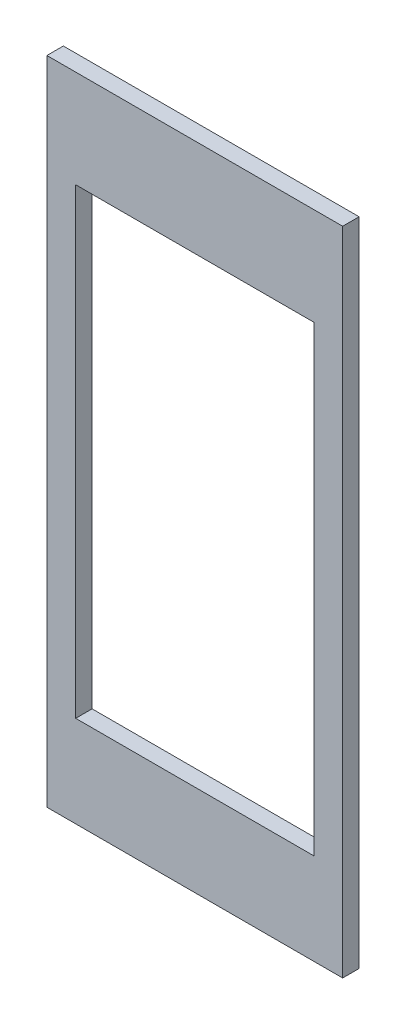
ISO-10303-21;
HEADER;
FILE_DESCRIPTION(('STEP AP214'),'2;1');
FILE_NAME('part.step','',(''),(''),'','','');
FILE_SCHEMA(('AUTOMOTIVE_DESIGN { 1 0 10303 214 1 1 1 1 }'));
ENDSEC;
DATA;
#1=APPLICATION_CONTEXT('core data for automotive mechanical design processes');
#2=APPLICATION_PROTOCOL_DEFINITION('international standard','automotive_design',2000,#1);
#3=PRODUCT_CONTEXT('',#1,'mechanical');
#4=PRODUCT('Part','Part','',(#3));
#5=PRODUCT_RELATED_PRODUCT_CATEGORY('part','',(#4));
#6=PRODUCT_DEFINITION_FORMATION('','',#4);
#7=PRODUCT_DEFINITION_CONTEXT('part definition',#1,'design');
#8=PRODUCT_DEFINITION('design','',#6,#7);
#9=PRODUCT_DEFINITION_SHAPE('','',#8);
#10=(LENGTH_UNIT() NAMED_UNIT(*) SI_UNIT(.MILLI.,.METRE.));
#11=(NAMED_UNIT(*) PLANE_ANGLE_UNIT() SI_UNIT($,.RADIAN.));
#12=(NAMED_UNIT(*) SI_UNIT($,.STERADIAN.) SOLID_ANGLE_UNIT());
#13=UNCERTAINTY_MEASURE_WITH_UNIT(LENGTH_MEASURE(1.E-05),#10,'distance_accuracy_value','');
#14=(GEOMETRIC_REPRESENTATION_CONTEXT(3) GLOBAL_UNCERTAINTY_ASSIGNED_CONTEXT((#13)) GLOBAL_UNIT_ASSIGNED_CONTEXT((#10,
#11,#12)) REPRESENTATION_CONTEXT('',''));
#15=CARTESIAN_POINT('',(0.,0.,0.));
#16=DIRECTION('',(0.,0.,1.));
#17=DIRECTION('',(1.,0.,0.));
#18=AXIS2_PLACEMENT_3D('',#15,#16,#17);
#19=CARTESIAN_POINT('',(0.,0.,1.5875));
#20=DIRECTION('',(0.,0.,1.));
#21=DIRECTION('',(1.,0.,0.));
#22=AXIS2_PLACEMENT_3D('',#19,#20,#21);
#23=PLANE('',#22);
#24=DIRECTION('',(0.,-1.,0.));
#25=VECTOR('',#24,1.);
#26=CARTESIAN_POINT('',(-28.575,62.9046875,1.5875));
#27=LINE('',#26,#25);
#28=CARTESIAN_POINT('',(-28.575,62.9046875,1.5875));
#29=VERTEX_POINT('',#28);
#30=CARTESIAN_POINT('',(-28.575,-62.9046875,1.5875));
#31=VERTEX_POINT('',#30);
#32=EDGE_CURVE('E138',#29,#31,#27,.T.);
#33=ORIENTED_EDGE('',*,*,#32,.T.);
#34=DIRECTION('',(1.,0.,0.));
#35=VECTOR('',#34,1.);
#36=CARTESIAN_POINT('',(-28.575,-62.9046875,1.5875));
#37=LINE('',#36,#35);
#38=CARTESIAN_POINT('',(28.575,-62.9046875,1.5875));
#39=VERTEX_POINT('',#38);
#40=EDGE_CURVE('E141',#31,#39,#37,.T.);
#41=ORIENTED_EDGE('',*,*,#40,.T.);
#42=DIRECTION('',(0.,1.,0.));
#43=VECTOR('',#42,1.);
#44=CARTESIAN_POINT('',(28.575,62.9046875,1.5875));
#45=LINE('',#44,#43);
#46=CARTESIAN_POINT('',(28.575,62.9046875,1.5875));
#47=VERTEX_POINT('',#46);
#48=EDGE_CURVE('E144',#39,#47,#45,.T.);
#49=ORIENTED_EDGE('',*,*,#48,.T.);
#50=DIRECTION('',(-1.,0.,0.));
#51=VECTOR('',#50,1.);
#52=CARTESIAN_POINT('',(-28.575,62.9046875,1.5875));
#53=LINE('',#52,#51);
#54=EDGE_CURVE('E146',#47,#29,#53,.T.);
#55=ORIENTED_EDGE('',*,*,#54,.T.);
#56=EDGE_LOOP('',(#33,#41,#49,#55));
#57=FACE_BOUND('',#56,.T.);
#58=DIRECTION('',(1.,0.,0.));
#59=VECTOR('',#58,1.);
#60=CARTESIAN_POINT('',(-23.01875,-45.24375,1.5875));
#61=LINE('',#60,#59);
#62=CARTESIAN_POINT('',(-23.01875,-45.24375,1.5875));
#63=VERTEX_POINT('',#62);
#64=CARTESIAN_POINT('',(23.01875,-45.24375,1.5875));
#65=VERTEX_POINT('',#64);
#66=EDGE_CURVE('E110',#63,#65,#61,.T.);
#67=ORIENTED_EDGE('',*,*,#66,.F.);
#68=DIRECTION('',(0.,-1.,0.));
#69=VECTOR('',#68,1.);
#70=CARTESIAN_POINT('',(-23.01875,44.053125,1.5875));
#71=LINE('',#70,#69);
#72=CARTESIAN_POINT('',(-23.01875,44.053125,1.5875));
#73=VERTEX_POINT('',#72);
#74=EDGE_CURVE('E102',#73,#63,#71,.T.);
#75=ORIENTED_EDGE('',*,*,#74,.F.);
#76=DIRECTION('',(-1.,0.,0.));
#77=VECTOR('',#76,1.);
#78=CARTESIAN_POINT('',(-23.01875,44.053125,1.5875));
#79=LINE('',#78,#77);
#80=CARTESIAN_POINT('',(23.01875,44.053125,1.5875));
#81=VERTEX_POINT('',#80);
#82=EDGE_CURVE('E124',#81,#73,#79,.T.);
#83=ORIENTED_EDGE('',*,*,#82,.F.);
#84=DIRECTION('',(0.,1.,0.));
#85=VECTOR('',#84,1.);
#86=CARTESIAN_POINT('',(23.01875,44.053125,1.5875));
#87=LINE('',#86,#85);
#88=EDGE_CURVE('E122',#65,#81,#87,.T.);
#89=ORIENTED_EDGE('',*,*,#88,.F.);
#90=EDGE_LOOP('',(#67,#75,#83,#89));
#91=FACE_BOUND('',#90,.T.);
#92=ADVANCED_FACE('F37',(#57,#91),#23,.T.);
#93=CARTESIAN_POINT('',(0.,0.,-1.5875));
#94=DIRECTION('',(0.,0.,1.));
#95=DIRECTION('',(1.,0.,0.));
#96=AXIS2_PLACEMENT_3D('',#93,#94,#95);
#97=PLANE('',#96);
#98=DIRECTION('',(0.,-1.,0.));
#99=VECTOR('',#98,1.);
#100=CARTESIAN_POINT('',(-28.575,62.9046875,-1.5875));
#101=LINE('',#100,#99);
#102=CARTESIAN_POINT('',(-28.575,62.9046875,-1.5875));
#103=VERTEX_POINT('',#102);
#104=CARTESIAN_POINT('',(-28.575,-62.9046875,-1.5875));
#105=VERTEX_POINT('',#104);
#106=EDGE_CURVE('E118',#103,#105,#101,.T.);
#107=ORIENTED_EDGE('',*,*,#106,.F.);
#108=DIRECTION('',(-1.,0.,0.));
#109=VECTOR('',#108,1.);
#110=CARTESIAN_POINT('',(-28.575,62.9046875,-1.5875));
#111=LINE('',#110,#109);
#112=CARTESIAN_POINT('',(28.575,62.9046875,-1.5875));
#113=VERTEX_POINT('',#112);
#114=EDGE_CURVE('E142',#113,#103,#111,.T.);
#115=ORIENTED_EDGE('',*,*,#114,.F.);
#116=DIRECTION('',(0.,1.,0.));
#117=VECTOR('',#116,1.);
#118=CARTESIAN_POINT('',(28.575,62.9046875,-1.5875));
#119=LINE('',#118,#117);
#120=CARTESIAN_POINT('',(28.575,-62.9046875,-1.5875));
#121=VERTEX_POINT('',#120);
#122=EDGE_CURVE('E153',#121,#113,#119,.T.);
#123=ORIENTED_EDGE('',*,*,#122,.F.);
#124=DIRECTION('',(1.,0.,0.));
#125=VECTOR('',#124,1.);
#126=CARTESIAN_POINT('',(-28.575,-62.9046875,-1.5875));
#127=LINE('',#126,#125);
#128=EDGE_CURVE('E151',#105,#121,#127,.T.);
#129=ORIENTED_EDGE('',*,*,#128,.F.);
#130=EDGE_LOOP('',(#107,#115,#123,#129));
#131=FACE_BOUND('',#130,.T.);
#132=DIRECTION('',(0.,-1.,0.));
#133=VECTOR('',#132,1.);
#134=CARTESIAN_POINT('',(-23.01875,44.053125,-1.5875));
#135=LINE('',#134,#133);
#136=CARTESIAN_POINT('',(-23.01875,44.053125,-1.5875));
#137=VERTEX_POINT('',#136);
#138=CARTESIAN_POINT('',(-23.01875,-45.24375,-1.5875));
#139=VERTEX_POINT('',#138);
#140=EDGE_CURVE('E60',#137,#139,#135,.T.);
#141=ORIENTED_EDGE('',*,*,#140,.T.);
#142=DIRECTION('',(1.,0.,0.));
#143=VECTOR('',#142,1.);
#144=CARTESIAN_POINT('',(-23.01875,-45.24375,-1.5875));
#145=LINE('',#144,#143);
#146=CARTESIAN_POINT('',(23.01875,-45.24375,-1.5875));
#147=VERTEX_POINT('',#146);
#148=EDGE_CURVE('E117',#139,#147,#145,.T.);
#149=ORIENTED_EDGE('',*,*,#148,.T.);
#150=DIRECTION('',(0.,1.,0.));
#151=VECTOR('',#150,1.);
#152=CARTESIAN_POINT('',(23.01875,44.053125,-1.5875));
#153=LINE('',#152,#151);
#154=CARTESIAN_POINT('',(23.01875,44.053125,-1.5875));
#155=VERTEX_POINT('',#154);
#156=EDGE_CURVE('E130',#147,#155,#153,.T.);
#157=ORIENTED_EDGE('',*,*,#156,.T.);
#158=DIRECTION('',(-1.,0.,0.));
#159=VECTOR('',#158,1.);
#160=CARTESIAN_POINT('',(-23.01875,44.053125,-1.5875));
#161=LINE('',#160,#159);
#162=EDGE_CURVE('E111',#155,#137,#161,.T.);
#163=ORIENTED_EDGE('',*,*,#162,.T.);
#164=EDGE_LOOP('',(#141,#149,#157,#163));
#165=FACE_BOUND('',#164,.T.);
#166=ADVANCED_FACE('F171',(#131,#165),#97,.F.);
#167=CARTESIAN_POINT('',(-28.575,62.9046875,1.5875));
#168=DIRECTION('',(1.,0.,0.));
#169=DIRECTION('',(0.,0.,-1.));
#170=AXIS2_PLACEMENT_3D('',#167,#168,#169);
#171=PLANE('',#170);
#172=ORIENTED_EDGE('',*,*,#106,.T.);
#173=DIRECTION('',(0.,0.,-1.));
#174=VECTOR('',#173,1.);
#175=CARTESIAN_POINT('',(-28.575,-62.9046875,1.5875));
#176=LINE('',#175,#174);
#177=EDGE_CURVE('E11',#31,#105,#176,.T.);
#178=ORIENTED_EDGE('',*,*,#177,.F.);
#179=ORIENTED_EDGE('',*,*,#32,.F.);
#180=DIRECTION('',(0.,0.,-1.));
#181=VECTOR('',#180,1.);
#182=CARTESIAN_POINT('',(-28.575,62.9046875,1.5875));
#183=LINE('',#182,#181);
#184=EDGE_CURVE('E148',#29,#103,#183,.T.);
#185=ORIENTED_EDGE('',*,*,#184,.T.);
#186=EDGE_LOOP('',(#172,#178,#179,#185));
#187=FACE_BOUND('',#186,.T.);
#188=ADVANCED_FACE('F39',(#187),#171,.F.);
#189=CARTESIAN_POINT('',(-28.575,-62.9046875,1.5875));
#190=DIRECTION('',(0.,1.,0.));
#191=DIRECTION('',(0.,0.,1.));
#192=AXIS2_PLACEMENT_3D('',#189,#190,#191);
#193=PLANE('',#192);
#194=ORIENTED_EDGE('',*,*,#128,.T.);
#195=DIRECTION('',(0.,0.,-1.));
#196=VECTOR('',#195,1.);
#197=CARTESIAN_POINT('',(28.575,-62.9046875,1.5875));
#198=LINE('',#197,#196);
#199=EDGE_CURVE('E45',#39,#121,#198,.T.);
#200=ORIENTED_EDGE('',*,*,#199,.F.);
#201=ORIENTED_EDGE('',*,*,#40,.F.);
#202=ORIENTED_EDGE('',*,*,#177,.T.);
#203=EDGE_LOOP('',(#194,#200,#201,#202));
#204=FACE_BOUND('',#203,.T.);
#205=ADVANCED_FACE('F181',(#204),#193,.F.);
#206=CARTESIAN_POINT('',(28.575,62.9046875,1.5875));
#207=DIRECTION('',(-1.,0.,0.));
#208=DIRECTION('',(0.,-1.,0.));
#209=AXIS2_PLACEMENT_3D('',#206,#207,#208);
#210=PLANE('',#209);
#211=ORIENTED_EDGE('',*,*,#122,.T.);
#212=DIRECTION('',(0.,0.,-1.));
#213=VECTOR('',#212,1.);
#214=CARTESIAN_POINT('',(28.575,62.9046875,1.5875));
#215=LINE('',#214,#213);
#216=EDGE_CURVE('E158',#47,#113,#215,.T.);
#217=ORIENTED_EDGE('',*,*,#216,.F.);
#218=ORIENTED_EDGE('',*,*,#48,.F.);
#219=ORIENTED_EDGE('',*,*,#199,.T.);
#220=EDGE_LOOP('',(#211,#217,#218,#219));
#221=FACE_BOUND('',#220,.T.);
#222=ADVANCED_FACE('F165',(#221),#210,.F.);
#223=CARTESIAN_POINT('',(-28.575,62.9046875,1.5875));
#224=DIRECTION('',(0.,-1.,0.));
#225=DIRECTION('',(1.,0.,0.));
#226=AXIS2_PLACEMENT_3D('',#223,#224,#225);
#227=PLANE('',#226);
#228=ORIENTED_EDGE('',*,*,#114,.T.);
#229=ORIENTED_EDGE('',*,*,#184,.F.);
#230=ORIENTED_EDGE('',*,*,#54,.F.);
#231=ORIENTED_EDGE('',*,*,#216,.T.);
#232=EDGE_LOOP('',(#228,#229,#230,#231));
#233=FACE_BOUND('',#232,.T.);
#234=ADVANCED_FACE('F175',(#233),#227,.F.);
#235=CARTESIAN_POINT('',(-23.01875,44.053125,1.5875));
#236=DIRECTION('',(1.,0.,0.));
#237=DIRECTION('',(0.,0.,-1.));
#238=AXIS2_PLACEMENT_3D('',#235,#236,#237);
#239=PLANE('',#238);
#240=ORIENTED_EDGE('',*,*,#140,.F.);
#241=DIRECTION('',(0.,0.,-1.));
#242=VECTOR('',#241,1.);
#243=CARTESIAN_POINT('',(-23.01875,44.053125,1.5875));
#244=LINE('',#243,#242);
#245=EDGE_CURVE('E106',#73,#137,#244,.T.);
#246=ORIENTED_EDGE('',*,*,#245,.F.);
#247=ORIENTED_EDGE('',*,*,#74,.T.);
#248=DIRECTION('',(0.,0.,-1.));
#249=VECTOR('',#248,1.);
#250=CARTESIAN_POINT('',(-23.01875,-45.24375,1.5875));
#251=LINE('',#250,#249);
#252=EDGE_CURVE('E105',#63,#139,#251,.T.);
#253=ORIENTED_EDGE('',*,*,#252,.T.);
#254=EDGE_LOOP('',(#240,#246,#247,#253));
#255=FACE_BOUND('',#254,.T.);
#256=ADVANCED_FACE('F104',(#255),#239,.T.);
#257=CARTESIAN_POINT('',(-23.01875,-45.24375,1.5875));
#258=DIRECTION('',(0.,1.,0.));
#259=DIRECTION('',(0.,0.,1.));
#260=AXIS2_PLACEMENT_3D('',#257,#258,#259);
#261=PLANE('',#260);
#262=ORIENTED_EDGE('',*,*,#148,.F.);
#263=ORIENTED_EDGE('',*,*,#252,.F.);
#264=ORIENTED_EDGE('',*,*,#66,.T.);
#265=DIRECTION('',(0.,0.,-1.));
#266=VECTOR('',#265,1.);
#267=CARTESIAN_POINT('',(23.01875,-45.24375,1.5875));
#268=LINE('',#267,#266);
#269=EDGE_CURVE('E119',#65,#147,#268,.T.);
#270=ORIENTED_EDGE('',*,*,#269,.T.);
#271=EDGE_LOOP('',(#262,#263,#264,#270));
#272=FACE_BOUND('',#271,.T.);
#273=ADVANCED_FACE('F114',(#272),#261,.T.);
#274=CARTESIAN_POINT('',(23.01875,44.053125,1.5875));
#275=DIRECTION('',(-1.,0.,0.));
#276=DIRECTION('',(0.,-1.,0.));
#277=AXIS2_PLACEMENT_3D('',#274,#275,#276);
#278=PLANE('',#277);
#279=ORIENTED_EDGE('',*,*,#156,.F.);
#280=ORIENTED_EDGE('',*,*,#269,.F.);
#281=ORIENTED_EDGE('',*,*,#88,.T.);
#282=DIRECTION('',(0.,0.,-1.));
#283=VECTOR('',#282,1.);
#284=CARTESIAN_POINT('',(23.01875,44.053125,1.5875));
#285=LINE('',#284,#283);
#286=EDGE_CURVE('E52',#81,#155,#285,.T.);
#287=ORIENTED_EDGE('',*,*,#286,.T.);
#288=EDGE_LOOP('',(#279,#280,#281,#287));
#289=FACE_BOUND('',#288,.T.);
#290=ADVANCED_FACE('F204',(#289),#278,.T.);
#291=CARTESIAN_POINT('',(-23.01875,44.053125,1.5875));
#292=DIRECTION('',(0.,-1.,0.));
#293=DIRECTION('',(0.,0.,-1.));
#294=AXIS2_PLACEMENT_3D('',#291,#292,#293);
#295=PLANE('',#294);
#296=ORIENTED_EDGE('',*,*,#162,.F.);
#297=ORIENTED_EDGE('',*,*,#286,.F.);
#298=ORIENTED_EDGE('',*,*,#82,.T.);
#299=ORIENTED_EDGE('',*,*,#245,.T.);
#300=EDGE_LOOP('',(#296,#297,#298,#299));
#301=FACE_BOUND('',#300,.T.);
#302=ADVANCED_FACE('F208',(#301),#295,.T.);
#303=CLOSED_SHELL('',(#92,#166,#188,#205,#222,#234,#256,#273,#290,#302));
#304=MANIFOLD_SOLID_BREP('B2',#303);
#305=ADVANCED_BREP_SHAPE_REPRESENTATION('',(#18,#304),#14);
#306=SHAPE_DEFINITION_REPRESENTATION(#9,#305);
ENDSEC;
END-ISO-10303-21;
